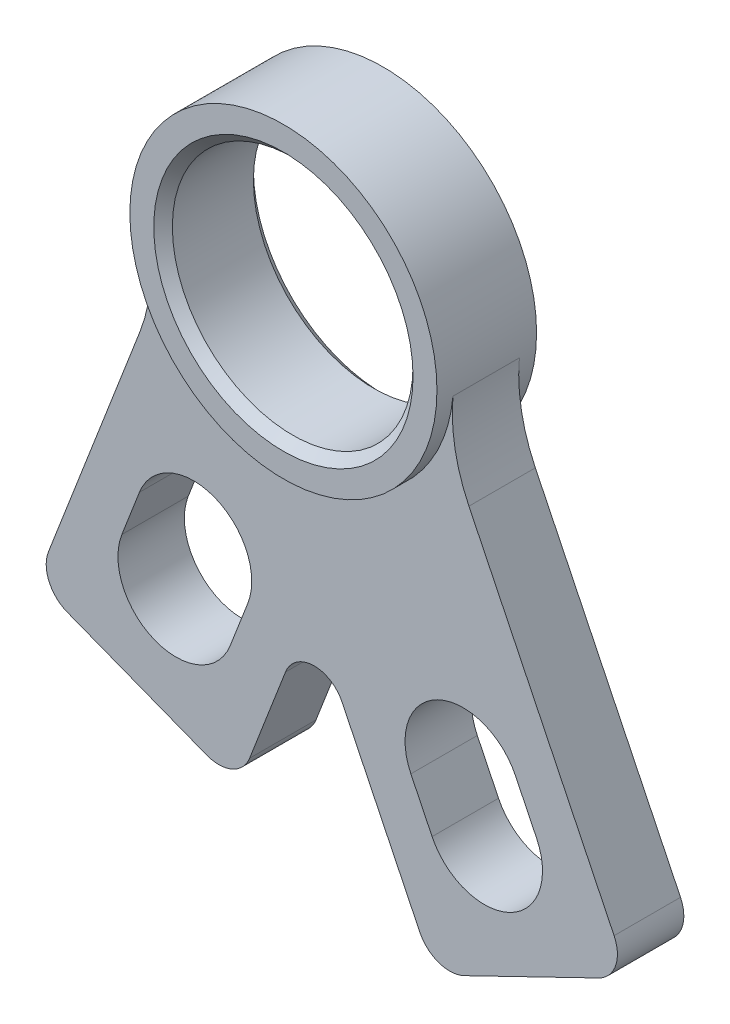
ISO-10303-21;
HEADER;
FILE_DESCRIPTION(('STEP AP214'),'2;1');
FILE_NAME('part.step','',(''),(''),'','','');
FILE_SCHEMA(('AUTOMOTIVE_DESIGN { 1 0 10303 214 1 1 1 1 }'));
ENDSEC;
DATA;
#1=APPLICATION_CONTEXT('core data for automotive mechanical design processes');
#2=APPLICATION_PROTOCOL_DEFINITION('international standard','automotive_design',2000,#1);
#3=PRODUCT_CONTEXT('',#1,'mechanical');
#4=PRODUCT('Part','Part','',(#3));
#5=PRODUCT_RELATED_PRODUCT_CATEGORY('part','',(#4));
#6=PRODUCT_DEFINITION_FORMATION('','',#4);
#7=PRODUCT_DEFINITION_CONTEXT('part definition',#1,'design');
#8=PRODUCT_DEFINITION('design','',#6,#7);
#9=PRODUCT_DEFINITION_SHAPE('','',#8);
#10=(LENGTH_UNIT() NAMED_UNIT(*) SI_UNIT(.MILLI.,.METRE.));
#11=(NAMED_UNIT(*) PLANE_ANGLE_UNIT() SI_UNIT($,.RADIAN.));
#12=(NAMED_UNIT(*) SI_UNIT($,.STERADIAN.) SOLID_ANGLE_UNIT());
#13=UNCERTAINTY_MEASURE_WITH_UNIT(LENGTH_MEASURE(1.E-05),#10,'distance_accuracy_value','');
#14=(GEOMETRIC_REPRESENTATION_CONTEXT(3) GLOBAL_UNCERTAINTY_ASSIGNED_CONTEXT((#13)) GLOBAL_UNIT_ASSIGNED_CONTEXT((#10,
#11,#12)) REPRESENTATION_CONTEXT('',''));
#15=CARTESIAN_POINT('',(0.,0.,0.));
#16=DIRECTION('',(0.,0.,1.));
#17=DIRECTION('',(1.,0.,0.));
#18=AXIS2_PLACEMENT_3D('',#15,#16,#17);
#19=CARTESIAN_POINT('',(0.,0.,4.7625));
#20=DIRECTION('',(0.,0.,-1.));
#21=DIRECTION('',(-1.,0.,0.));
#22=AXIS2_PLACEMENT_3D('',#19,#20,#21);
#23=CYLINDRICAL_SURFACE('',#22,11.5062);
#24=CARTESIAN_POINT('',(0.,0.,-3.87350000000002));
#25=DIRECTION('',(0.,0.,1.));
#26=DIRECTION('',(1.,0.,0.));
#27=AXIS2_PLACEMENT_3D('',#24,#25,#26);
#28=CIRCLE('',#27,11.5062);
#29=CARTESIAN_POINT('',(-11.5062,0.,-3.87350000000002));
#30=VERTEX_POINT('',#29);
#31=EDGE_CURVE('E50',#30,#30,#28,.F.);
#32=CARTESIAN_POINT('',(0.,0.,3.87349999999996));
#33=DIRECTION('',(0.,0.,1.));
#34=DIRECTION('',(1.,0.,0.));
#35=AXIS2_PLACEMENT_3D('',#32,#33,#34);
#36=CIRCLE('',#35,11.5062);
#37=CARTESIAN_POINT('',(-11.5062,0.,3.87349999999996));
#38=VERTEX_POINT('',#37);
#39=EDGE_CURVE('E480',#38,#38,#36,.T.);
#40=CARTESIAN_POINT('',(-11.5062,0.,-3.87350000000002));
#41=CARTESIAN_POINT('',(-11.5062,0.,-3.79280208333335));
#42=CARTESIAN_POINT('',(-11.5062,0.,-3.71210416666668));
#43=CARTESIAN_POINT('',(-11.5062,0.,-3.55070833333335));
#44=CARTESIAN_POINT('',(-11.5062,0.,-3.47001041666668));
#45=CARTESIAN_POINT('',(-11.5062,0.,-3.30861458333335));
#46=CARTESIAN_POINT('',(-11.5062,0.,-3.22791666666669));
#47=CARTESIAN_POINT('',(-11.5062,0.,-3.06652083333335));
#48=CARTESIAN_POINT('',(-11.5062,0.,-2.98582291666669));
#49=CARTESIAN_POINT('',(-11.5062,0.,-2.82442708333335));
#50=CARTESIAN_POINT('',(-11.5062,0.,-2.74372916666669));
#51=CARTESIAN_POINT('',(-11.5062,0.,-2.58233333333335));
#52=CARTESIAN_POINT('',(-11.5062,0.,-2.50163541666669));
#53=CARTESIAN_POINT('',(-11.5062,0.,-2.34023958333336));
#54=CARTESIAN_POINT('',(-11.5062,0.,-2.25954166666669));
#55=CARTESIAN_POINT('',(-11.5062,0.,-2.09814583333336));
#56=CARTESIAN_POINT('',(-11.5062,0.,-2.01744791666669));
#57=CARTESIAN_POINT('',(-11.5062,0.,-1.85605208333336));
#58=CARTESIAN_POINT('',(-11.5062,0.,-1.77535416666669));
#59=CARTESIAN_POINT('',(-11.5062,0.,-1.61395833333336));
#60=CARTESIAN_POINT('',(-11.5062,0.,-1.53326041666669));
#61=CARTESIAN_POINT('',(-11.5062,0.,-1.37186458333336));
#62=CARTESIAN_POINT('',(-11.5062,0.,-1.29116666666669));
#63=CARTESIAN_POINT('',(-11.5062,0.,-1.12977083333336));
#64=CARTESIAN_POINT('',(-11.5062,0.,-1.04907291666669));
#65=CARTESIAN_POINT('',(-11.5062,0.,-0.887677083333361));
#66=CARTESIAN_POINT('',(-11.5062,0.,-0.806979166666695));
#67=CARTESIAN_POINT('',(-11.5062,0.,-0.645583333333362));
#68=CARTESIAN_POINT('',(-11.5062,0.,-0.564885416666695));
#69=CARTESIAN_POINT('',(-11.5062,0.,-0.403489583333362));
#70=CARTESIAN_POINT('',(-11.5062,0.,-0.322791666666696));
#71=CARTESIAN_POINT('',(-11.5062,0.,-0.161395833333363));
#72=CARTESIAN_POINT('',(-11.5062,0.,-0.0806979166666968));
#73=CARTESIAN_POINT('',(-11.5062,0.,0.0806979166666361));
#74=CARTESIAN_POINT('',(-11.5062,0.,0.161395833333302));
#75=CARTESIAN_POINT('',(-11.5062,0.,0.322791666666635));
#76=CARTESIAN_POINT('',(-11.5062,0.,0.403489583333302));
#77=CARTESIAN_POINT('',(-11.5062,0.,0.564885416666635));
#78=CARTESIAN_POINT('',(-11.5062,0.,0.645583333333301));
#79=CARTESIAN_POINT('',(-11.5062,0.,0.806979166666634));
#80=CARTESIAN_POINT('',(-11.5062,0.,0.8876770833333));
#81=CARTESIAN_POINT('',(-11.5062,0.,1.04907291666663));
#82=CARTESIAN_POINT('',(-11.5062,0.,1.1297708333333));
#83=CARTESIAN_POINT('',(-11.5062,0.,1.29116666666663));
#84=CARTESIAN_POINT('',(-11.5062,0.,1.3718645833333));
#85=CARTESIAN_POINT('',(-11.5062,0.,1.53326041666663));
#86=CARTESIAN_POINT('',(-11.5062,0.,1.6139583333333));
#87=CARTESIAN_POINT('',(-11.5062,0.,1.77535416666663));
#88=CARTESIAN_POINT('',(-11.5062,0.,1.8560520833333));
#89=CARTESIAN_POINT('',(-11.5062,0.,2.01744791666663));
#90=CARTESIAN_POINT('',(-11.5062,0.,2.0981458333333));
#91=CARTESIAN_POINT('',(-11.5062,0.,2.25954166666663));
#92=CARTESIAN_POINT('',(-11.5062,0.,2.34023958333329));
#93=CARTESIAN_POINT('',(-11.5062,0.,2.50163541666663));
#94=CARTESIAN_POINT('',(-11.5062,0.,2.58233333333329));
#95=CARTESIAN_POINT('',(-11.5062,0.,2.74372916666663));
#96=CARTESIAN_POINT('',(-11.5062,0.,2.82442708333329));
#97=CARTESIAN_POINT('',(-11.5062,0.,2.98582291666663));
#98=CARTESIAN_POINT('',(-11.5062,0.,3.06652083333329));
#99=CARTESIAN_POINT('',(-11.5062,0.,3.22791666666662));
#100=CARTESIAN_POINT('',(-11.5062,0.,3.30861458333329));
#101=CARTESIAN_POINT('',(-11.5062,0.,3.47001041666662));
#102=CARTESIAN_POINT('',(-11.5062,0.,3.55070833333329));
#103=CARTESIAN_POINT('',(-11.5062,0.,3.71210416666662));
#104=CARTESIAN_POINT('',(-11.5062,0.,3.79280208333329));
#105=CARTESIAN_POINT('',(-11.5062,0.,3.87349999999996));
#106=B_SPLINE_CURVE_WITH_KNOTS('',3,(#40,#41,#42,#43,#44,#45,#46,#47,#48,#49,#50,#51,#52,#53,
#54,#55,#56,#57,#58,#59,#60,#61,#62,#63,#64,#65,#66,#67,#68,#69,#70,#71,#72,#73,#74,#75,#76,#77,
#78,#79,#80,#81,#82,#83,#84,#85,#86,#87,#88,#89,#90,#91,#92,#93,#94,#95,#96,#97,#98,#99,#100,
#101,#102,#103,#104,#105),.UNSPECIFIED.,.F.,.F.,(4,2,2,2,2,2,2,2,2,2,2,2,2,2,2,2,2,2,2,2,2,2,2,
2,2,2,2,2,2,2,2,2,4),(0.,0.242093749999998,0.484187499999998,0.726281249999997,
0.968374999999996,1.21046875,1.45256249999999,1.69465624999999,1.93674999999999,
2.17884374999999,2.42093749999999,2.66303124999999,2.90512499999999,3.14721874999999,
3.38931249999999,3.63140624999999,3.87349999999999,4.11559374999999,4.35768749999998,
4.59978124999998,4.84187499999998,5.08396874999998,5.32606249999998,5.56815624999998,
5.81024999999998,6.05234374999998,6.29443749999998,6.53653124999998,6.77862499999998,
7.02071874999997,7.26281249999997,7.50490624999997,7.74699999999997),.UNSPECIFIED.);
#107=EDGE_CURVE('BSEAM41',#30,#38,#106,.T.);
#108=ORIENTED_EDGE('',*,*,#31,.T.);
#109=ORIENTED_EDGE('',*,*,#39,.T.);
#110=ORIENTED_EDGE('',*,*,#107,.T.);
#111=ORIENTED_EDGE('',*,*,#107,.F.);
#112=EDGE_LOOP('',(#108,#110,#109,#111));
#113=FACE_BOUND('',#112,.T.);
#114=ADVANCED_FACE('F41',(#113),#23,.F.);
#115=CARTESIAN_POINT('',(0.,0.,4.7625));
#116=DIRECTION('',(0.,0.,-1.));
#117=DIRECTION('',(-1.,0.,0.));
#118=AXIS2_PLACEMENT_3D('',#115,#116,#117);
#119=CYLINDRICAL_SURFACE('',#118,14.6812);
#120=DIRECTION('',(0.,0.,-1.));
#121=VECTOR('',#120,1.);
#122=CARTESIAN_POINT('',(-14.4661395463881,-2.50368529660316,3.175));
#123=LINE('',#122,#121);
#124=CARTESIAN_POINT('',(-14.4661395463881,-2.50368529660317,3.175));
#125=VERTEX_POINT('',#124);
#126=CARTESIAN_POINT('',(-14.4661395463881,-2.50368529660317,-3.175));
#127=VERTEX_POINT('',#126);
#128=EDGE_CURVE('E428',#125,#127,#123,.T.);
#129=ORIENTED_EDGE('',*,*,#128,.F.);
#130=CARTESIAN_POINT('',(0.,0.,3.175));
#131=DIRECTION('',(0.,0.,1.));
#132=DIRECTION('',(1.,0.,0.));
#133=AXIS2_PLACEMENT_3D('',#130,#131,#132);
#134=CIRCLE('',#133,14.6812);
#135=CARTESIAN_POINT('',(14.6225689560155,-1.31076716718586,3.175));
#136=VERTEX_POINT('',#135);
#137=EDGE_CURVE('E287',#125,#136,#134,.T.);
#138=ORIENTED_EDGE('',*,*,#137,.T.);
#139=DIRECTION('',(0.,0.,-1.));
#140=VECTOR('',#139,1.);
#141=CARTESIAN_POINT('',(14.6225689560155,-1.31076716718586,3.175));
#142=LINE('',#141,#140);
#143=CARTESIAN_POINT('',(14.6225689560155,-1.31076716718586,-3.175));
#144=VERTEX_POINT('',#143);
#145=EDGE_CURVE('E431',#136,#144,#142,.T.);
#146=ORIENTED_EDGE('',*,*,#145,.T.);
#147=CARTESIAN_POINT('',(0.,0.,-3.175));
#148=DIRECTION('',(0.,0.,1.));
#149=DIRECTION('',(1.,0.,0.));
#150=AXIS2_PLACEMENT_3D('',#147,#148,#149);
#151=CIRCLE('',#150,14.6812);
#152=EDGE_CURVE('E357',#127,#144,#151,.T.);
#153=ORIENTED_EDGE('',*,*,#152,.F.);
#154=EDGE_LOOP('',(#129,#138,#146,#153));
#155=FACE_BOUND('',#154,.T.);
#156=CARTESIAN_POINT('',(0.,0.,4.7625));
#157=DIRECTION('',(0.,0.,1.));
#158=DIRECTION('',(1.,0.,0.));
#159=AXIS2_PLACEMENT_3D('',#156,#157,#158);
#160=CIRCLE('',#159,14.6812);
#161=CARTESIAN_POINT('',(14.6812,0.,4.7625));
#162=VERTEX_POINT('',#161);
#163=EDGE_CURVE('E449',#162,#162,#160,.T.);
#164=ORIENTED_EDGE('',*,*,#163,.F.);
#165=EDGE_LOOP('',(#164));
#166=FACE_BOUND('',#165,.T.);
#167=CARTESIAN_POINT('',(0.,0.,-4.7625));
#168=DIRECTION('',(0.,0.,1.));
#169=DIRECTION('',(1.,0.,0.));
#170=AXIS2_PLACEMENT_3D('',#167,#168,#169);
#171=CIRCLE('',#170,14.6812);
#172=CARTESIAN_POINT('',(14.6812,0.,-4.7625));
#173=VERTEX_POINT('',#172);
#174=EDGE_CURVE('E412',#173,#173,#171,.T.);
#175=ORIENTED_EDGE('',*,*,#174,.T.);
#176=EDGE_LOOP('',(#175));
#177=FACE_BOUND('',#176,.T.);
#178=ADVANCED_FACE('F503',(#155,#166,#177),#119,.T.);
#179=CARTESIAN_POINT('',(0.,0.,4.7625));
#180=DIRECTION('',(0.,0.,1.));
#181=DIRECTION('',(1.,0.,0.));
#182=AXIS2_PLACEMENT_3D('',#179,#180,#181);
#183=PLANE('',#182);
#184=CARTESIAN_POINT('',(0.,0.,4.7625));
#185=DIRECTION('',(0.,0.,1.));
#186=DIRECTION('',(1.,0.,0.));
#187=AXIS2_PLACEMENT_3D('',#184,#185,#186);
#188=CIRCLE('',#187,12.3952);
#189=CARTESIAN_POINT('',(12.3952,0.,4.7625));
#190=VERTEX_POINT('',#189);
#191=EDGE_CURVE('E11',#190,#190,#188,.F.);
#192=ORIENTED_EDGE('',*,*,#191,.T.);
#193=EDGE_LOOP('',(#192));
#194=FACE_BOUND('',#193,.T.);
#195=ORIENTED_EDGE('',*,*,#163,.T.);
#196=EDGE_LOOP('',(#195));
#197=FACE_BOUND('',#196,.T.);
#198=ADVANCED_FACE('F499',(#194,#197),#183,.T.);
#199=CARTESIAN_POINT('',(0.,0.,-4.7625));
#200=DIRECTION('',(0.,0.,1.));
#201=DIRECTION('',(1.,0.,0.));
#202=AXIS2_PLACEMENT_3D('',#199,#200,#201);
#203=PLANE('',#202);
#204=CARTESIAN_POINT('',(0.,0.,-4.7625));
#205=DIRECTION('',(0.,0.,1.));
#206=DIRECTION('',(1.,0.,0.));
#207=AXIS2_PLACEMENT_3D('',#204,#205,#206);
#208=CIRCLE('',#207,12.3952);
#209=CARTESIAN_POINT('',(12.3952,0.,-4.7625));
#210=VERTEX_POINT('',#209);
#211=EDGE_CURVE('E476',#210,#210,#208,.T.);
#212=ORIENTED_EDGE('',*,*,#211,.T.);
#213=EDGE_LOOP('',(#212));
#214=FACE_BOUND('',#213,.T.);
#215=ORIENTED_EDGE('',*,*,#174,.F.);
#216=EDGE_LOOP('',(#215));
#217=FACE_BOUND('',#216,.T.);
#218=ADVANCED_FACE('F495',(#214,#217),#203,.F.);
#219=CARTESIAN_POINT('',(15.5995031163131,-32.1680392605869,3.175));
#220=DIRECTION('',(0.,0.,-1.));
#221=DIRECTION('',(-1.,0.,0.));
#222=AXIS2_PLACEMENT_3D('',#219,#220,#221);
#223=CYLINDRICAL_SURFACE('',#222,5.5562499999984);
#224=CARTESIAN_POINT('',(15.5995031163131,-32.1680392605869,-3.175));
#225=DIRECTION('',(0.,0.,1.));
#226=DIRECTION('',(1.,0.,0.));
#227=AXIS2_PLACEMENT_3D('',#224,#225,#226);
#228=CIRCLE('',#227,5.5562499999984);
#229=CARTESIAN_POINT('',(20.5989196461262,-29.7436324416074,-3.175));
#230=VERTEX_POINT('',#229);
#231=CARTESIAN_POINT('',(10.6000865865001,-34.5924460795664,-3.175));
#232=VERTEX_POINT('',#231);
#233=EDGE_CURVE('E388',#230,#232,#228,.T.);
#234=ORIENTED_EDGE('',*,*,#233,.F.);
#235=DIRECTION('',(0.,0.,-1.));
#236=VECTOR('',#235,1.);
#237=CARTESIAN_POINT('',(20.5989196461262,-29.7436324416074,3.175));
#238=LINE('',#237,#236);
#239=CARTESIAN_POINT('',(20.5989196461262,-29.7436324416074,3.175));
#240=VERTEX_POINT('',#239);
#241=EDGE_CURVE('E409',#240,#230,#238,.T.);
#242=ORIENTED_EDGE('',*,*,#241,.F.);
#243=CARTESIAN_POINT('',(15.5995031163131,-32.1680392605869,3.175));
#244=DIRECTION('',(0.,0.,1.));
#245=DIRECTION('',(1.,0.,0.));
#246=AXIS2_PLACEMENT_3D('',#243,#244,#245);
#247=CIRCLE('',#246,5.5562499999984);
#248=CARTESIAN_POINT('',(10.6000865865001,-34.5924460795664,3.175));
#249=VERTEX_POINT('',#248);
#250=EDGE_CURVE('E314',#240,#249,#247,.T.);
#251=ORIENTED_EDGE('',*,*,#250,.T.);
#252=DIRECTION('',(0.,0.,-1.));
#253=VECTOR('',#252,1.);
#254=CARTESIAN_POINT('',(10.6000865865001,-34.5924460795664,3.175));
#255=LINE('',#254,#253);
#256=EDGE_CURVE('E399',#249,#232,#255,.T.);
#257=ORIENTED_EDGE('',*,*,#256,.T.);
#258=EDGE_LOOP('',(#234,#242,#251,#257));
#259=FACE_BOUND('',#258,.T.);
#260=ADVANCED_FACE('F498',(#259),#223,.F.);
#261=CARTESIAN_POINT('',(4.99941652981302,2.42440681897946,3.175));
#262=DIRECTION('',(-0.89978250255379,-0.436338685080796,0.));
#263=DIRECTION('',(0.436338685080796,-0.89978250255379,0.));
#264=AXIS2_PLACEMENT_3D('',#261,#262,#263);
#265=PLANE('',#264);
#266=DIRECTION('',(-0.436338685080796,0.89978250255379,0.));
#267=VECTOR('',#266,1.);
#268=CARTESIAN_POINT('',(4.99941652981302,2.42440681897946,-3.175));
#269=LINE('',#268,#267);
#270=CARTESIAN_POINT('',(22.6267282232279,-33.925216010955,-3.175));
#271=VERTEX_POINT('',#270);
#272=EDGE_CURVE('E392',#271,#230,#269,.T.);
#273=ORIENTED_EDGE('',*,*,#272,.F.);
#274=DIRECTION('',(0.,0.,-1.));
#275=VECTOR('',#274,1.);
#276=CARTESIAN_POINT('',(22.6267282232279,-33.925216010955,3.175));
#277=LINE('',#276,#275);
#278=CARTESIAN_POINT('',(22.6267282232279,-33.925216010955,3.175));
#279=VERTEX_POINT('',#278);
#280=EDGE_CURVE('E406',#279,#271,#277,.T.);
#281=ORIENTED_EDGE('',*,*,#280,.F.);
#282=DIRECTION('',(-0.436338685080796,0.89978250255379,0.));
#283=VECTOR('',#282,1.);
#284=CARTESIAN_POINT('',(4.99941652981302,2.42440681897946,3.175));
#285=LINE('',#284,#283);
#286=EDGE_CURVE('E318',#279,#240,#285,.T.);
#287=ORIENTED_EDGE('',*,*,#286,.T.);
#288=ORIENTED_EDGE('',*,*,#241,.T.);
#289=EDGE_LOOP('',(#273,#281,#287,#288));
#290=FACE_BOUND('',#289,.T.);
#291=ADVANCED_FACE('F712',(#290),#265,.T.);
#292=CARTESIAN_POINT('',(17.6273116934148,-36.3496228299345,3.175));
#293=DIRECTION('',(0.,0.,-1.));
#294=DIRECTION('',(-1.,0.,0.));
#295=AXIS2_PLACEMENT_3D('',#292,#293,#294);
#296=CYLINDRICAL_SURFACE('',#295,5.5562499999984);
#297=CARTESIAN_POINT('',(17.6273116934148,-36.3496228299345,-3.175));
#298=DIRECTION('',(0.,0.,1.));
#299=DIRECTION('',(1.,0.,0.));
#300=AXIS2_PLACEMENT_3D('',#297,#298,#299);
#301=CIRCLE('',#300,5.5562499999984);
#302=CARTESIAN_POINT('',(12.6278951636018,-38.774029648914,-3.175));
#303=VERTEX_POINT('',#302);
#304=EDGE_CURVE('E265',#303,#271,#301,.T.);
#305=ORIENTED_EDGE('',*,*,#304,.F.);
#306=DIRECTION('',(0.,0.,-1.));
#307=VECTOR('',#306,1.);
#308=CARTESIAN_POINT('',(12.6278951636018,-38.774029648914,3.175));
#309=LINE('',#308,#307);
#310=CARTESIAN_POINT('',(12.6278951636018,-38.774029648914,3.175));
#311=VERTEX_POINT('',#310);
#312=EDGE_CURVE('E402',#311,#303,#309,.T.);
#313=ORIENTED_EDGE('',*,*,#312,.F.);
#314=CARTESIAN_POINT('',(17.6273116934148,-36.3496228299345,3.175));
#315=DIRECTION('',(0.,0.,1.));
#316=DIRECTION('',(1.,0.,0.));
#317=AXIS2_PLACEMENT_3D('',#314,#315,#316);
#318=CIRCLE('',#317,5.5562499999984);
#319=EDGE_CURVE('E322',#311,#279,#318,.T.);
#320=ORIENTED_EDGE('',*,*,#319,.T.);
#321=ORIENTED_EDGE('',*,*,#280,.T.);
#322=EDGE_LOOP('',(#305,#313,#320,#321));
#323=FACE_BOUND('',#322,.T.);
#324=ADVANCED_FACE('F603',(#323),#296,.F.);
#325=CARTESIAN_POINT('',(-10.1727122090915,-26.2624614180122,3.175));
#326=DIRECTION('',(0.,0.,-1.));
#327=DIRECTION('',(-1.,0.,0.));
#328=AXIS2_PLACEMENT_3D('',#325,#326,#327);
#329=CYLINDRICAL_SURFACE('',#328,5.55624999999839);
#330=CARTESIAN_POINT('',(-10.1727122090915,-26.2624614180122,-3.175));
#331=DIRECTION('',(0.,0.,1.));
#332=DIRECTION('',(1.,0.,0.));
#333=AXIS2_PLACEMENT_3D('',#330,#331,#332);
#334=CIRCLE('',#333,5.55624999999839);
#335=CARTESIAN_POINT('',(-4.99156905500975,-28.2693669163837,-3.175));
#336=VERTEX_POINT('',#335);
#337=CARTESIAN_POINT('',(-15.3538553631733,-24.2555559196406,-3.175));
#338=VERTEX_POINT('',#337);
#339=EDGE_CURVE('E372',#336,#338,#334,.T.);
#340=ORIENTED_EDGE('',*,*,#339,.F.);
#341=DIRECTION('',(0.,0.,-1.));
#342=VECTOR('',#341,1.);
#343=CARTESIAN_POINT('',(-4.99156905500975,-28.2693669163837,3.175));
#344=LINE('',#343,#342);
#345=CARTESIAN_POINT('',(-4.99156905500975,-28.2693669163837,3.175));
#346=VERTEX_POINT('',#345);
#347=EDGE_CURVE('E403',#346,#336,#344,.T.);
#348=ORIENTED_EDGE('',*,*,#347,.F.);
#349=CARTESIAN_POINT('',(-10.1727122090915,-26.2624614180122,3.175));
#350=DIRECTION('',(0.,0.,1.));
#351=DIRECTION('',(1.,0.,0.));
#352=AXIS2_PLACEMENT_3D('',#349,#350,#351);
#353=CIRCLE('',#352,5.55624999999839);
#354=CARTESIAN_POINT('',(-15.3538553631733,-24.2555559196406,3.175));
#355=VERTEX_POINT('',#354);
#356=EDGE_CURVE('E299',#346,#355,#353,.T.);
#357=ORIENTED_EDGE('',*,*,#356,.T.);
#358=DIRECTION('',(0.,0.,-1.));
#359=VECTOR('',#358,1.);
#360=CARTESIAN_POINT('',(-15.3538553631733,-24.2555559196406,3.175));
#361=LINE('',#360,#359);
#362=EDGE_CURVE('E242',#355,#338,#361,.T.);
#363=ORIENTED_EDGE('',*,*,#362,.T.);
#364=EDGE_LOOP('',(#340,#348,#357,#363));
#365=FACE_BOUND('',#364,.T.);
#366=ADVANCED_FACE('F593',(#365),#329,.F.);
#367=CARTESIAN_POINT('',(5.18114315408177,-2.00690549837153,3.175));
#368=DIRECTION('',(-0.932489206584164,0.361197839976981,0.));
#369=DIRECTION('',(-0.361197839976981,-0.932489206584164,0.));
#370=AXIS2_PLACEMENT_3D('',#367,#368,#369);
#371=PLANE('',#370);
#372=DIRECTION('',(0.361197839976981,0.932489206584164,0.));
#373=VECTOR('',#372,1.);
#374=CARTESIAN_POINT('',(5.18114315408177,-2.00690549837153,-3.175));
#375=LINE('',#374,#373);
#376=CARTESIAN_POINT('',(-6.67017354959018,-32.6029492363103,-3.175));
#377=VERTEX_POINT('',#376);
#378=EDGE_CURVE('E376',#377,#336,#375,.T.);
#379=ORIENTED_EDGE('',*,*,#378,.F.);
#380=DIRECTION('',(0.,0.,-1.));
#381=VECTOR('',#380,1.);
#382=CARTESIAN_POINT('',(-6.67017354959018,-32.6029492363103,3.175));
#383=LINE('',#382,#381);
#384=CARTESIAN_POINT('',(-6.67017354959018,-32.6029492363103,3.175));
#385=VERTEX_POINT('',#384);
#386=EDGE_CURVE('E418',#385,#377,#383,.T.);
#387=ORIENTED_EDGE('',*,*,#386,.F.);
#388=DIRECTION('',(0.361197839976981,0.932489206584164,0.));
#389=VECTOR('',#388,1.);
#390=CARTESIAN_POINT('',(5.18114315408177,-2.00690549837153,3.175));
#391=LINE('',#390,#389);
#392=EDGE_CURVE('E303',#385,#346,#391,.T.);
#393=ORIENTED_EDGE('',*,*,#392,.T.);
#394=ORIENTED_EDGE('',*,*,#347,.T.);
#395=EDGE_LOOP('',(#379,#387,#393,#394));
#396=FACE_BOUND('',#395,.T.);
#397=ADVANCED_FACE('F587',(#396),#371,.T.);
#398=CARTESIAN_POINT('',(-11.8513167036719,-30.5960437379387,3.175));
#399=DIRECTION('',(0.,0.,-1.));
#400=DIRECTION('',(-1.,0.,0.));
#401=AXIS2_PLACEMENT_3D('',#398,#399,#400);
#402=CYLINDRICAL_SURFACE('',#401,5.55624999999839);
#403=CARTESIAN_POINT('',(-11.8513167036719,-30.5960437379387,-3.175));
#404=DIRECTION('',(0.,0.,1.));
#405=DIRECTION('',(1.,0.,0.));
#406=AXIS2_PLACEMENT_3D('',#403,#404,#405);
#407=CIRCLE('',#406,5.55624999999839);
#408=CARTESIAN_POINT('',(-17.0324598577537,-28.5891382395672,-3.175));
#409=VERTEX_POINT('',#408);
#410=EDGE_CURVE('E380',#409,#377,#407,.T.);
#411=ORIENTED_EDGE('',*,*,#410,.F.);
#412=DIRECTION('',(0.,0.,-1.));
#413=VECTOR('',#412,1.);
#414=CARTESIAN_POINT('',(-17.0324598577537,-28.5891382395672,3.175));
#415=LINE('',#414,#413);
#416=CARTESIAN_POINT('',(-17.0324598577537,-28.5891382395672,3.175));
#417=VERTEX_POINT('',#416);
#418=EDGE_CURVE('E415',#417,#409,#415,.T.);
#419=ORIENTED_EDGE('',*,*,#418,.F.);
#420=CARTESIAN_POINT('',(-11.8513167036719,-30.5960437379387,3.175));
#421=DIRECTION('',(0.,0.,1.));
#422=DIRECTION('',(1.,0.,0.));
#423=AXIS2_PLACEMENT_3D('',#420,#421,#422);
#424=CIRCLE('',#423,5.55624999999839);
#425=EDGE_CURVE('E307',#417,#385,#424,.T.);
#426=ORIENTED_EDGE('',*,*,#425,.T.);
#427=ORIENTED_EDGE('',*,*,#386,.T.);
#428=EDGE_LOOP('',(#411,#419,#426,#427));
#429=FACE_BOUND('',#428,.T.);
#430=ADVANCED_FACE('F583',(#429),#402,.F.);
#431=CARTESIAN_POINT('',(-7.77007688476361,-39.8379952118207,3.175));
#432=DIRECTION('',(0.,0.,-1.));
#433=DIRECTION('',(-1.,0.,0.));
#434=AXIS2_PLACEMENT_3D('',#431,#432,#433);
#435=CYLINDRICAL_SURFACE('',#434,3.175);
#436=CARTESIAN_POINT('',(-7.77007688476361,-39.8379952118207,-3.175));
#437=DIRECTION('',(0.,0.,1.));
#438=DIRECTION('',(1.,0.,0.));
#439=AXIS2_PLACEMENT_3D('',#436,#437,#438);
#440=CIRCLE('',#439,3.175);
#441=CARTESIAN_POINT('',(-4.82012448348686,-41.0120505044715,-3.175));
#442=VERTEX_POINT('',#441);
#443=CARTESIAN_POINT('',(-8.8895303596633,-42.8090975186312,-3.175));
#444=VERTEX_POINT('',#443);
#445=EDGE_CURVE('E238',#442,#444,#440,.F.);
#446=ORIENTED_EDGE('',*,*,#445,.F.);
#447=DIRECTION('',(0.,0.,-1.));
#448=VECTOR('',#447,1.);
#449=CARTESIAN_POINT('',(-4.82012448348686,-41.0120505044715,3.175));
#450=LINE('',#449,#448);
#451=CARTESIAN_POINT('',(-4.82012448348686,-41.0120505044715,3.175));
#452=VERTEX_POINT('',#451);
#453=EDGE_CURVE('E231',#452,#442,#450,.T.);
#454=ORIENTED_EDGE('',*,*,#453,.F.);
#455=CARTESIAN_POINT('',(-7.77007688476361,-39.8379952118207,3.175));
#456=DIRECTION('',(0.,0.,1.));
#457=DIRECTION('',(1.,0.,0.));
#458=AXIS2_PLACEMENT_3D('',#455,#456,#457);
#459=CIRCLE('',#458,3.175);
#460=CARTESIAN_POINT('',(-8.8895303596633,-42.8090975186312,3.175));
#461=VERTEX_POINT('',#460);
#462=EDGE_CURVE('E236',#452,#461,#459,.F.);
#463=ORIENTED_EDGE('',*,*,#462,.T.);
#464=DIRECTION('',(0.,0.,-1.));
#465=VECTOR('',#464,1.);
#466=CARTESIAN_POINT('',(-8.8895303596633,-42.8090975186312,3.175));
#467=LINE('',#466,#465);
#468=EDGE_CURVE('E329',#461,#444,#467,.T.);
#469=ORIENTED_EDGE('',*,*,#468,.T.);
#470=EDGE_LOOP('',(#446,#454,#463,#469));
#471=FACE_BOUND('',#470,.T.);
#472=ADVANCED_FACE('F233',(#471),#435,.T.);
#473=CARTESIAN_POINT('',(9.62212300043885,-3.72711021126189,3.175));
#474=DIRECTION('',(-0.932489206584164,0.361197839976981,0.));
#475=DIRECTION('',(-0.361197839976981,-0.932489206584164,0.));
#476=AXIS2_PLACEMENT_3D('',#473,#474,#475);
#477=PLANE('',#476);
#478=DIRECTION('',(0.361197839976981,0.932489206584164,0.));
#479=VECTOR('',#478,1.);
#480=CARTESIAN_POINT('',(9.62212300043885,-3.72711021126189,-3.175));
#481=LINE('',#480,#479);
#482=CARTESIAN_POINT('',(-1.38989145594289,-32.1563627892373,-3.175));
#483=VERTEX_POINT('',#482);
#484=EDGE_CURVE('E332',#442,#483,#481,.T.);
#485=ORIENTED_EDGE('',*,*,#484,.T.);
#486=DIRECTION('',(0.,0.,-1.));
#487=VECTOR('',#486,1.);
#488=CARTESIAN_POINT('',(-1.38989145594289,-32.1563627892373,3.175));
#489=LINE('',#488,#487);
#490=CARTESIAN_POINT('',(-1.38989145594289,-32.1563627892373,3.175));
#491=VERTEX_POINT('',#490);
#492=EDGE_CURVE('E243',#491,#483,#489,.T.);
#493=ORIENTED_EDGE('',*,*,#492,.F.);
#494=DIRECTION('',(0.361197839976981,0.932489206584164,0.));
#495=VECTOR('',#494,1.);
#496=CARTESIAN_POINT('',(9.62212300043885,-3.72711021126189,3.175));
#497=LINE('',#496,#495);
#498=EDGE_CURVE('E246',#452,#491,#497,.T.);
#499=ORIENTED_EDGE('',*,*,#498,.F.);
#500=ORIENTED_EDGE('',*,*,#453,.T.);
#501=EDGE_LOOP('',(#485,#493,#499,#500));
#502=FACE_BOUND('',#501,.T.);
#503=ADVANCED_FACE('F247',(#502),#477,.F.);
#504=CARTESIAN_POINT('',(1.36244245301173,-33.2224738560361,3.175));
#505=DIRECTION('',(0.,0.,-1.));
#506=DIRECTION('',(-1.,0.,0.));
#507=AXIS2_PLACEMENT_3D('',#504,#505,#506);
#508=CYLINDRICAL_SURFACE('',#507,2.95159867751908);
#509=CARTESIAN_POINT('',(1.36244245301173,-33.2224738560361,-3.175));
#510=DIRECTION('',(0.,0.,1.));
#511=DIRECTION('',(1.,0.,0.));
#512=AXIS2_PLACEMENT_3D('',#509,#510,#511);
#513=CIRCLE('',#512,2.95159867751908);
#514=CARTESIAN_POINT('',(4.01823929760431,-31.9345771702012,-3.175));
#515=VERTEX_POINT('',#514);
#516=EDGE_CURVE('E335',#483,#515,#513,.F.);
#517=ORIENTED_EDGE('',*,*,#516,.T.);
#518=DIRECTION('',(0.,0.,-1.));
#519=VECTOR('',#518,1.);
#520=CARTESIAN_POINT('',(4.01823929760431,-31.9345771702012,3.175));
#521=LINE('',#520,#519);
#522=CARTESIAN_POINT('',(4.01823929760431,-31.9345771702012,3.175));
#523=VERTEX_POINT('',#522);
#524=EDGE_CURVE('E444',#523,#515,#521,.T.);
#525=ORIENTED_EDGE('',*,*,#524,.F.);
#526=CARTESIAN_POINT('',(1.36244245301173,-33.2224738560361,3.175));
#527=DIRECTION('',(0.,0.,1.));
#528=DIRECTION('',(1.,0.,0.));
#529=AXIS2_PLACEMENT_3D('',#526,#527,#528);
#530=CIRCLE('',#529,2.95159867751908);
#531=EDGE_CURVE('E251',#491,#523,#530,.F.);
#532=ORIENTED_EDGE('',*,*,#531,.F.);
#533=ORIENTED_EDGE('',*,*,#492,.T.);
#534=EDGE_LOOP('',(#517,#525,#532,#533));
#535=FACE_BOUND('',#534,.T.);
#536=ADVANCED_FACE('F555',(#535),#508,.F.);
#537=CARTESIAN_POINT('',(-9.28463069822552,-4.50246980667678,3.175));
#538=DIRECTION('',(-0.89978250255379,-0.436338685080796,0.));
#539=DIRECTION('',(0.436338685080796,-0.899782502553791,0.));
#540=AXIS2_PLACEMENT_3D('',#537,#538,#539);
#541=PLANE('',#540);
#542=DIRECTION('',(-0.436338685080796,0.89978250255379,0.));
#543=VECTOR('',#542,1.);
#544=CARTESIAN_POINT('',(-9.28463069822552,-4.50246980667678,-3.175));
#545=LINE('',#544,#543);
#546=CARTESIAN_POINT('',(11.4597754767346,-47.2799138892285,-3.175));
#547=VERTEX_POINT('',#546);
#548=EDGE_CURVE('E339',#547,#515,#545,.T.);
#549=ORIENTED_EDGE('',*,*,#548,.F.);
#550=DIRECTION('',(0.,0.,-1.));
#551=VECTOR('',#550,1.);
#552=CARTESIAN_POINT('',(11.4597754767346,-47.2799138892285,3.175));
#553=LINE('',#552,#551);
#554=CARTESIAN_POINT('',(11.4597754767346,-47.2799138892285,3.175));
#555=VERTEX_POINT('',#554);
#556=EDGE_CURVE('E441',#555,#547,#553,.T.);
#557=ORIENTED_EDGE('',*,*,#556,.F.);
#558=DIRECTION('',(-0.436338685080796,0.89978250255379,0.));
#559=VECTOR('',#558,1.);
#560=CARTESIAN_POINT('',(-9.28463069822552,-4.50246980667678,3.175));
#561=LINE('',#560,#559);
#562=EDGE_CURVE('E270',#555,#523,#561,.T.);
#563=ORIENTED_EDGE('',*,*,#562,.T.);
#564=ORIENTED_EDGE('',*,*,#524,.T.);
#565=EDGE_LOOP('',(#549,#557,#563,#564));
#566=FACE_BOUND('',#565,.T.);
#567=ADVANCED_FACE('F572',(#566),#541,.T.);
#568=CARTESIAN_POINT('',(14.3165849223429,-45.894538564097,3.175));
#569=DIRECTION('',(0.,0.,-1.));
#570=DIRECTION('',(-1.,0.,0.));
#571=AXIS2_PLACEMENT_3D('',#568,#569,#570);
#572=CYLINDRICAL_SURFACE('',#571,3.175);
#573=CARTESIAN_POINT('',(14.3165849223429,-45.894538564097,-3.175));
#574=DIRECTION('',(0.,0.,1.));
#575=DIRECTION('',(1.,0.,0.));
#576=AXIS2_PLACEMENT_3D('',#573,#574,#575);
#577=CIRCLE('',#576,3.175);
#578=CARTESIAN_POINT('',(15.7019602474744,-48.7513480097053,-3.175));
#579=VERTEX_POINT('',#578);
#580=EDGE_CURVE('E343',#579,#547,#577,.F.);
#581=ORIENTED_EDGE('',*,*,#580,.F.);
#582=DIRECTION('',(0.,0.,-1.));
#583=VECTOR('',#582,1.);
#584=CARTESIAN_POINT('',(15.7019602474744,-48.7513480097053,3.175));
#585=LINE('',#584,#583);
#586=CARTESIAN_POINT('',(15.7019602474744,-48.7513480097053,3.175));
#587=VERTEX_POINT('',#586);
#588=EDGE_CURVE('E438',#587,#579,#585,.T.);
#589=ORIENTED_EDGE('',*,*,#588,.F.);
#590=CARTESIAN_POINT('',(14.3165849223429,-45.894538564097,3.175));
#591=DIRECTION('',(0.,0.,1.));
#592=DIRECTION('',(1.,0.,0.));
#593=AXIS2_PLACEMENT_3D('',#590,#591,#592);
#594=CIRCLE('',#593,3.175);
#595=EDGE_CURVE('E274',#587,#555,#594,.F.);
#596=ORIENTED_EDGE('',*,*,#595,.T.);
#597=ORIENTED_EDGE('',*,*,#556,.T.);
#598=EDGE_LOOP('',(#581,#589,#596,#597));
#599=FACE_BOUND('',#598,.T.);
#600=ADVANCED_FACE('F562',(#599),#572,.T.);
#601=CARTESIAN_POINT('',(22.1297815000916,-45.63425352816,3.175));
#602=DIRECTION('',(-0.436338685080796,0.89978250255379,0.));
#603=DIRECTION('',(-0.89978250255379,-0.436338685080796,0.));
#604=AXIS2_PLACEMENT_3D('',#601,#602,#603);
#605=PLANE('',#604);
#606=DIRECTION('',(0.89978250255379,0.436338685080797,0.));
#607=VECTOR('',#606,1.);
#608=CARTESIAN_POINT('',(22.1297815000916,-45.63425352816,-3.175));
#609=LINE('',#608,#607);
#610=CARTESIAN_POINT('',(28.5576027527088,-42.5171590466148,-3.175));
#611=VERTEX_POINT('',#610);
#612=EDGE_CURVE('E347',#579,#611,#609,.T.);
#613=ORIENTED_EDGE('',*,*,#612,.T.);
#614=DIRECTION('',(0.,0.,-1.));
#615=VECTOR('',#614,1.);
#616=CARTESIAN_POINT('',(28.5576027527088,-42.5171590466148,3.175));
#617=LINE('',#616,#615);
#618=CARTESIAN_POINT('',(28.5576027527088,-42.5171590466148,3.175));
#619=VERTEX_POINT('',#618);
#620=EDGE_CURVE('E71',#611,#619,#617,.F.);
#621=ORIENTED_EDGE('',*,*,#620,.T.);
#622=DIRECTION('',(0.89978250255379,0.436338685080797,0.));
#623=VECTOR('',#622,1.);
#624=CARTESIAN_POINT('',(22.1297815000916,-45.63425352816,3.175));
#625=LINE('',#624,#623);
#626=EDGE_CURVE('E278',#587,#619,#625,.T.);
#627=ORIENTED_EDGE('',*,*,#626,.F.);
#628=ORIENTED_EDGE('',*,*,#588,.T.);
#629=EDGE_LOOP('',(#613,#621,#627,#628));
#630=FACE_BOUND('',#629,.T.);
#631=ADVANCED_FACE('F564',(#630),#605,.F.);
#632=CARTESIAN_POINT('',(9.28463069822543,4.50246980667674,3.175));
#633=DIRECTION('',(-0.89978250255379,-0.436338685080796,0.));
#634=DIRECTION('',(0.436338685080796,-0.89978250255379,0.));
#635=AXIS2_PLACEMENT_3D('',#632,#633,#634);
#636=PLANE('',#635);
#637=DIRECTION('',(-0.436338685080796,0.89978250255379,0.));
#638=VECTOR('',#637,1.);
#639=CARTESIAN_POINT('',(9.28463069822543,4.50246980667674,3.175));
#640=LINE('',#639,#638);
#641=CARTESIAN_POINT('',(30.0290368731855,-38.274974275875,3.175));
#642=VERTEX_POINT('',#641);
#643=CARTESIAN_POINT('',(16.1501231077484,-9.65499583348482,3.175));
#644=VERTEX_POINT('',#643);
#645=EDGE_CURVE('E280',#642,#644,#640,.T.);
#646=ORIENTED_EDGE('',*,*,#645,.F.);
#647=DIRECTION('',(0.,0.,-1.));
#648=VECTOR('',#647,1.);
#649=CARTESIAN_POINT('',(30.0290368731855,-38.274974275875,3.175));
#650=LINE('',#649,#648);
#651=CARTESIAN_POINT('',(30.0290368731855,-38.274974275875,-3.175));
#652=VERTEX_POINT('',#651);
#653=EDGE_CURVE('E470',#642,#652,#650,.T.);
#654=ORIENTED_EDGE('',*,*,#653,.T.);
#655=DIRECTION('',(-0.436338685080796,0.89978250255379,0.));
#656=VECTOR('',#655,1.);
#657=CARTESIAN_POINT('',(9.28463069822543,4.50246980667674,-3.175));
#658=LINE('',#657,#656);
#659=CARTESIAN_POINT('',(16.1501231077484,-9.65499583348482,-3.175));
#660=VERTEX_POINT('',#659);
#661=EDGE_CURVE('E350',#652,#660,#658,.T.);
#662=ORIENTED_EDGE('',*,*,#661,.T.);
#663=DIRECTION('',(0.,0.,-1.));
#664=VECTOR('',#663,1.);
#665=CARTESIAN_POINT('',(16.1501231077484,-9.65499583348482,3.175));
#666=LINE('',#665,#664);
#667=EDGE_CURVE('E434',#644,#660,#666,.T.);
#668=ORIENTED_EDGE('',*,*,#667,.F.);
#669=EDGE_LOOP('',(#646,#654,#662,#668));
#670=FACE_BOUND('',#669,.T.);
#671=ADVANCED_FACE('F528',(#670),#636,.F.);
#672=CARTESIAN_POINT('',(30.4341703357884,-2.72811920782787,3.175));
#673=DIRECTION('',(0.,0.,-1.));
#674=DIRECTION('',(-1.,0.,0.));
#675=AXIS2_PLACEMENT_3D('',#672,#673,#674);
#676=CYLINDRICAL_SURFACE('',#675,15.8749999999984);
#677=CARTESIAN_POINT('',(30.4341703357884,-2.72811920782787,-3.175));
#678=DIRECTION('',(0.,0.,1.));
#679=DIRECTION('',(1.,0.,0.));
#680=AXIS2_PLACEMENT_3D('',#677,#678,#679);
#681=CIRCLE('',#680,15.8749999999984);
#682=EDGE_CURVE('E353',#660,#144,#681,.F.);
#683=ORIENTED_EDGE('',*,*,#682,.T.);
#684=ORIENTED_EDGE('',*,*,#145,.F.);
#685=CARTESIAN_POINT('',(30.4341703357884,-2.72811920782787,3.175));
#686=DIRECTION('',(0.,0.,1.));
#687=DIRECTION('',(1.,0.,0.));
#688=AXIS2_PLACEMENT_3D('',#685,#686,#687);
#689=CIRCLE('',#688,15.8749999999984);
#690=EDGE_CURVE('E283',#644,#136,#689,.F.);
#691=ORIENTED_EDGE('',*,*,#690,.F.);
#692=ORIENTED_EDGE('',*,*,#667,.T.);
#693=EDGE_LOOP('',(#683,#684,#691,#692));
#694=FACE_BOUND('',#693,.T.);
#695=ADVANCED_FACE('F537',(#694),#676,.F.);
#696=CARTESIAN_POINT('',(-30.1085914780345,-5.21095745988486,3.175));
#697=DIRECTION('',(0.,0.,-1.));
#698=DIRECTION('',(-1.,0.,0.));
#699=AXIS2_PLACEMENT_3D('',#696,#697,#698);
#700=CYLINDRICAL_SURFACE('',#699,15.8749999999984);
#701=CARTESIAN_POINT('',(-30.1085914780345,-5.21095745988486,-3.175));
#702=DIRECTION('',(0.,0.,1.));
#703=DIRECTION('',(1.,0.,0.));
#704=AXIS2_PLACEMENT_3D('',#701,#702,#703);
#705=CIRCLE('',#704,15.8749999999984);
#706=CARTESIAN_POINT('',(-15.3053253235124,-10.9449731695189,-3.175));
#707=VERTEX_POINT('',#706);
#708=EDGE_CURVE('E361',#707,#127,#705,.T.);
#709=ORIENTED_EDGE('',*,*,#708,.F.);
#710=DIRECTION('',(0.,0.,-1.));
#711=VECTOR('',#710,1.);
#712=CARTESIAN_POINT('',(-15.3053253235124,-10.9449731695189,3.175));
#713=LINE('',#712,#711);
#714=CARTESIAN_POINT('',(-15.3053253235124,-10.9449731695189,3.175));
#715=VERTEX_POINT('',#714);
#716=EDGE_CURVE('E425',#715,#707,#713,.T.);
#717=ORIENTED_EDGE('',*,*,#716,.F.);
#718=CARTESIAN_POINT('',(-30.1085914780345,-5.21095745988486,3.175));
#719=DIRECTION('',(0.,0.,1.));
#720=DIRECTION('',(1.,0.,0.));
#721=AXIS2_PLACEMENT_3D('',#718,#719,#720);
#722=CIRCLE('',#721,15.8749999999984);
#723=EDGE_CURVE('E290',#715,#125,#722,.T.);
#724=ORIENTED_EDGE('',*,*,#723,.T.);
#725=ORIENTED_EDGE('',*,*,#128,.T.);
#726=EDGE_LOOP('',(#709,#717,#724,#725));
#727=FACE_BOUND('',#726,.T.);
#728=ADVANCED_FACE('F543',(#727),#700,.F.);
#729=CARTESIAN_POINT('',(-9.62212300043882,3.72711021126188,3.175));
#730=DIRECTION('',(0.932489206584164,-0.361197839976981,0.));
#731=DIRECTION('',(0.361197839976981,0.932489206584164,0.));
#732=AXIS2_PLACEMENT_3D('',#729,#730,#731);
#733=PLANE('',#732);
#734=DIRECTION('',(-0.361197839976981,-0.932489206584164,0.));
#735=VECTOR('',#734,1.);
#736=CARTESIAN_POINT('',(-9.62212300043882,3.72711021126188,-3.175));
#737=LINE('',#736,#735);
#738=CARTESIAN_POINT('',(-24.0537467734458,-33.530403296211,-3.175));
#739=VERTEX_POINT('',#738);
#740=EDGE_CURVE('E365',#707,#739,#737,.T.);
#741=ORIENTED_EDGE('',*,*,#740,.T.);
#742=DIRECTION('',(0.,0.,-1.));
#743=VECTOR('',#742,1.);
#744=CARTESIAN_POINT('',(-24.0537467734458,-33.530403296211,3.175));
#745=LINE('',#744,#743);
#746=CARTESIAN_POINT('',(-24.0537467734458,-33.530403296211,3.175));
#747=VERTEX_POINT('',#746);
#748=EDGE_CURVE('E464',#739,#747,#745,.F.);
#749=ORIENTED_EDGE('',*,*,#748,.T.);
#750=DIRECTION('',(-0.361197839976981,-0.932489206584164,0.));
#751=VECTOR('',#750,1.);
#752=CARTESIAN_POINT('',(-9.62212300043882,3.72711021126188,3.175));
#753=LINE('',#752,#751);
#754=EDGE_CURVE('E294',#715,#747,#753,.T.);
#755=ORIENTED_EDGE('',*,*,#754,.F.);
#756=ORIENTED_EDGE('',*,*,#716,.T.);
#757=EDGE_LOOP('',(#741,#749,#755,#756));
#758=FACE_BOUND('',#757,.T.);
#759=ADVANCED_FACE('F547',(#758),#733,.F.);
#760=CARTESIAN_POINT('',(-5.18114315408174,2.00690549837151,3.175));
#761=DIRECTION('',(-0.932489206584164,0.361197839976981,0.));
#762=DIRECTION('',(-0.361197839976981,-0.932489206584164,0.));
#763=AXIS2_PLACEMENT_3D('',#760,#761,#762);
#764=PLANE('',#763);
#765=DIRECTION('',(0.361197839976981,0.932489206584164,0.));
#766=VECTOR('',#765,1.);
#767=CARTESIAN_POINT('',(-5.18114315408174,2.00690549837151,-3.175));
#768=LINE('',#767,#766);
#769=EDGE_CURVE('E384',#409,#338,#768,.T.);
#770=ORIENTED_EDGE('',*,*,#769,.T.);
#771=ORIENTED_EDGE('',*,*,#362,.F.);
#772=DIRECTION('',(0.361197839976981,0.932489206584164,0.));
#773=VECTOR('',#772,1.);
#774=CARTESIAN_POINT('',(-5.18114315408174,2.00690549837151,3.175));
#775=LINE('',#774,#773);
#776=EDGE_CURVE('E311',#417,#355,#775,.T.);
#777=ORIENTED_EDGE('',*,*,#776,.F.);
#778=ORIENTED_EDGE('',*,*,#418,.T.);
#779=EDGE_LOOP('',(#770,#771,#777,#778));
#780=FACE_BOUND('',#779,.T.);
#781=ADVANCED_FACE('F598',(#780),#764,.F.);
#782=CARTESIAN_POINT('',(-15.5784269149338,-40.2181667383776,3.175));
#783=DIRECTION('',(0.361197839976981,0.932489206584164,0.));
#784=DIRECTION('',(-0.932489206584164,0.361197839976981,0.));
#785=AXIS2_PLACEMENT_3D('',#782,#783,#784);
#786=PLANE('',#785);
#787=DIRECTION('',(0.932489206584164,-0.361197839976981,0.));
#788=VECTOR('',#787,1.);
#789=CARTESIAN_POINT('',(-15.5784269149338,-40.2181667383776,3.175));
#790=LINE('',#789,#788);
#791=CARTESIAN_POINT('',(-22.239896684468,-37.6378596690426,3.175));
#792=VERTEX_POINT('',#791);
#793=EDGE_CURVE('E257',#792,#461,#790,.T.);
#794=ORIENTED_EDGE('',*,*,#793,.F.);
#795=DIRECTION('',(0.,0.,-1.));
#796=VECTOR('',#795,1.);
#797=CARTESIAN_POINT('',(-22.239896684468,-37.6378596690426,3.175));
#798=LINE('',#797,#796);
#799=CARTESIAN_POINT('',(-22.239896684468,-37.6378596690426,-3.175));
#800=VERTEX_POINT('',#799);
#801=EDGE_CURVE('E453',#792,#800,#798,.T.);
#802=ORIENTED_EDGE('',*,*,#801,.T.);
#803=DIRECTION('',(0.932489206584164,-0.361197839976981,0.));
#804=VECTOR('',#803,1.);
#805=CARTESIAN_POINT('',(-15.5784269149338,-40.2181667383776,-3.175));
#806=LINE('',#805,#804);
#807=EDGE_CURVE('E369',#800,#444,#806,.T.);
#808=ORIENTED_EDGE('',*,*,#807,.T.);
#809=ORIENTED_EDGE('',*,*,#468,.F.);
#810=EDGE_LOOP('',(#794,#802,#808,#809));
#811=FACE_BOUND('',#810,.T.);
#812=ADVANCED_FACE('F552',(#811),#786,.F.);
#813=CARTESIAN_POINT('',(-4.9994165298131,-2.4244068189795,3.175));
#814=DIRECTION('',(-0.89978250255379,-0.436338685080796,0.));
#815=DIRECTION('',(0.436338685080796,-0.899782502553791,0.));
#816=AXIS2_PLACEMENT_3D('',#813,#814,#815);
#817=PLANE('',#816);
#818=DIRECTION('',(-0.436338685080796,0.89978250255379,0.));
#819=VECTOR('',#818,1.);
#820=CARTESIAN_POINT('',(-4.9994165298131,-2.4244068189795,-3.175));
#821=LINE('',#820,#819);
#822=EDGE_CURVE('E260',#303,#232,#821,.T.);
#823=ORIENTED_EDGE('',*,*,#822,.T.);
#824=ORIENTED_EDGE('',*,*,#256,.F.);
#825=DIRECTION('',(-0.436338685080796,0.89978250255379,0.));
#826=VECTOR('',#825,1.);
#827=CARTESIAN_POINT('',(-4.9994165298131,-2.4244068189795,3.175));
#828=LINE('',#827,#826);
#829=EDGE_CURVE('E326',#311,#249,#828,.T.);
#830=ORIENTED_EDGE('',*,*,#829,.F.);
#831=ORIENTED_EDGE('',*,*,#312,.T.);
#832=EDGE_LOOP('',(#823,#824,#830,#831));
#833=FACE_BOUND('',#832,.T.);
#834=ADVANCED_FACE('F607',(#833),#817,.F.);
#835=CARTESIAN_POINT('',(0.,0.,3.175));
#836=DIRECTION('',(0.,0.,1.));
#837=DIRECTION('',(1.,0.,0.));
#838=AXIS2_PLACEMENT_3D('',#835,#836,#837);
#839=PLANE('',#838);
#840=ORIENTED_EDGE('',*,*,#754,.T.);
#841=CARTESIAN_POINT('',(-21.093093542541,-34.6772064381379,3.175));
#842=DIRECTION('',(0.,0.,1.));
#843=DIRECTION('',(1.,0.,0.));
#844=AXIS2_PLACEMENT_3D('',#841,#842,#843);
#845=CIRCLE('',#844,3.175);
#846=EDGE_CURVE('E468',#747,#792,#845,.T.);
#847=ORIENTED_EDGE('',*,*,#846,.T.);
#848=ORIENTED_EDGE('',*,*,#793,.T.);
#849=ORIENTED_EDGE('',*,*,#462,.F.);
#850=ORIENTED_EDGE('',*,*,#498,.T.);
#851=ORIENTED_EDGE('',*,*,#531,.T.);
#852=ORIENTED_EDGE('',*,*,#562,.F.);
#853=ORIENTED_EDGE('',*,*,#595,.F.);
#854=ORIENTED_EDGE('',*,*,#626,.T.);
#855=CARTESIAN_POINT('',(27.1722274275773,-39.6603496010065,3.175));
#856=DIRECTION('',(0.,0.,1.));
#857=DIRECTION('',(1.,0.,0.));
#858=AXIS2_PLACEMENT_3D('',#855,#856,#857);
#859=CIRCLE('',#858,3.175);
#860=EDGE_CURVE('E60',#619,#642,#859,.T.);
#861=ORIENTED_EDGE('',*,*,#860,.T.);
#862=ORIENTED_EDGE('',*,*,#645,.T.);
#863=ORIENTED_EDGE('',*,*,#690,.T.);
#864=ORIENTED_EDGE('',*,*,#137,.F.);
#865=ORIENTED_EDGE('',*,*,#723,.F.);
#866=EDGE_LOOP('',(#840,#847,#848,#849,#850,#851,#852,#853,#854,#861,#862,#863,#864,#865));
#867=FACE_BOUND('',#866,.T.);
#868=ORIENTED_EDGE('',*,*,#356,.F.);
#869=ORIENTED_EDGE('',*,*,#392,.F.);
#870=ORIENTED_EDGE('',*,*,#425,.F.);
#871=ORIENTED_EDGE('',*,*,#776,.T.);
#872=EDGE_LOOP('',(#868,#869,#870,#871));
#873=FACE_BOUND('',#872,.T.);
#874=ORIENTED_EDGE('',*,*,#250,.F.);
#875=ORIENTED_EDGE('',*,*,#286,.F.);
#876=ORIENTED_EDGE('',*,*,#319,.F.);
#877=ORIENTED_EDGE('',*,*,#829,.T.);
#878=EDGE_LOOP('',(#874,#875,#876,#877));
#879=FACE_BOUND('',#878,.T.);
#880=ADVANCED_FACE('F254',(#867,#873,#879),#839,.T.);
#881=CARTESIAN_POINT('',(0.,0.,-3.175));
#882=DIRECTION('',(0.,0.,1.));
#883=DIRECTION('',(1.,0.,0.));
#884=AXIS2_PLACEMENT_3D('',#881,#882,#883);
#885=PLANE('',#884);
#886=ORIENTED_EDGE('',*,*,#807,.F.);
#887=CARTESIAN_POINT('',(-21.093093542541,-34.6772064381379,-3.175));
#888=DIRECTION('',(0.,0.,1.));
#889=DIRECTION('',(1.,0.,0.));
#890=AXIS2_PLACEMENT_3D('',#887,#888,#889);
#891=CIRCLE('',#890,3.175);
#892=EDGE_CURVE('E462',#800,#739,#891,.F.);
#893=ORIENTED_EDGE('',*,*,#892,.T.);
#894=ORIENTED_EDGE('',*,*,#740,.F.);
#895=ORIENTED_EDGE('',*,*,#708,.T.);
#896=ORIENTED_EDGE('',*,*,#152,.T.);
#897=ORIENTED_EDGE('',*,*,#682,.F.);
#898=ORIENTED_EDGE('',*,*,#661,.F.);
#899=CARTESIAN_POINT('',(27.1722274275773,-39.6603496010065,-3.175));
#900=DIRECTION('',(0.,0.,1.));
#901=DIRECTION('',(1.,0.,0.));
#902=AXIS2_PLACEMENT_3D('',#899,#900,#901);
#903=CIRCLE('',#902,3.175);
#904=EDGE_CURVE('E459',#652,#611,#903,.F.);
#905=ORIENTED_EDGE('',*,*,#904,.T.);
#906=ORIENTED_EDGE('',*,*,#612,.F.);
#907=ORIENTED_EDGE('',*,*,#580,.T.);
#908=ORIENTED_EDGE('',*,*,#548,.T.);
#909=ORIENTED_EDGE('',*,*,#516,.F.);
#910=ORIENTED_EDGE('',*,*,#484,.F.);
#911=ORIENTED_EDGE('',*,*,#445,.T.);
#912=EDGE_LOOP('',(#886,#893,#894,#895,#896,#897,#898,#905,#906,#907,#908,#909,#910,#911));
#913=FACE_BOUND('',#912,.T.);
#914=ORIENTED_EDGE('',*,*,#339,.T.);
#915=ORIENTED_EDGE('',*,*,#769,.F.);
#916=ORIENTED_EDGE('',*,*,#410,.T.);
#917=ORIENTED_EDGE('',*,*,#378,.T.);
#918=EDGE_LOOP('',(#914,#915,#916,#917));
#919=FACE_BOUND('',#918,.T.);
#920=ORIENTED_EDGE('',*,*,#233,.T.);
#921=ORIENTED_EDGE('',*,*,#822,.F.);
#922=ORIENTED_EDGE('',*,*,#304,.T.);
#923=ORIENTED_EDGE('',*,*,#272,.T.);
#924=EDGE_LOOP('',(#920,#921,#922,#923));
#925=FACE_BOUND('',#924,.T.);
#926=ADVANCED_FACE('F519',(#913,#919,#925),#885,.F.);
#927=CARTESIAN_POINT('',(-21.093093542541,-34.6772064381379,3.175));
#928=DIRECTION('',(0.,0.,-1.));
#929=DIRECTION('',(-1.,0.,0.));
#930=AXIS2_PLACEMENT_3D('',#927,#928,#929);
#931=CYLINDRICAL_SURFACE('',#930,3.175);
#932=ORIENTED_EDGE('',*,*,#846,.F.);
#933=ORIENTED_EDGE('',*,*,#748,.F.);
#934=ORIENTED_EDGE('',*,*,#892,.F.);
#935=ORIENTED_EDGE('',*,*,#801,.F.);
#936=EDGE_LOOP('',(#932,#933,#934,#935));
#937=FACE_BOUND('',#936,.T.);
#938=ADVANCED_FACE('F516',(#937),#931,.T.);
#939=CARTESIAN_POINT('',(27.1722274275773,-39.6603496010065,3.175));
#940=DIRECTION('',(0.,0.,-1.));
#941=DIRECTION('',(-1.,0.,0.));
#942=AXIS2_PLACEMENT_3D('',#939,#940,#941);
#943=CYLINDRICAL_SURFACE('',#942,3.175);
#944=ORIENTED_EDGE('',*,*,#860,.F.);
#945=ORIENTED_EDGE('',*,*,#620,.F.);
#946=ORIENTED_EDGE('',*,*,#904,.F.);
#947=ORIENTED_EDGE('',*,*,#653,.F.);
#948=EDGE_LOOP('',(#944,#945,#946,#947));
#949=FACE_BOUND('',#948,.T.);
#950=ADVANCED_FACE('F492',(#949),#943,.T.);
#951=CARTESIAN_POINT('',(0.,0.,-4.7625));
#952=DIRECTION('',(0.,0.,-1.));
#953=DIRECTION('',(-1.,0.,0.));
#954=AXIS2_PLACEMENT_3D('',#951,#952,#953);
#955=CONICAL_SURFACE('',#954,12.3952,0.785398163397445);
#956=ORIENTED_EDGE('',*,*,#31,.F.);
#957=EDGE_LOOP('',(#956));
#958=FACE_BOUND('',#957,.T.);
#959=ORIENTED_EDGE('',*,*,#211,.F.);
#960=EDGE_LOOP('',(#959));
#961=FACE_BOUND('',#960,.T.);
#962=ADVANCED_FACE('F489',(#958,#961),#955,.F.);
#963=CARTESIAN_POINT('',(0.,0.,3.87349999999996));
#964=DIRECTION('',(0.,0.,1.));
#965=DIRECTION('',(1.,0.,0.));
#966=AXIS2_PLACEMENT_3D('',#963,#964,#965);
#967=CONICAL_SURFACE('',#966,11.5062,0.785398163397451);
#968=ORIENTED_EDGE('',*,*,#191,.F.);
#969=EDGE_LOOP('',(#968));
#970=FACE_BOUND('',#969,.T.);
#971=ORIENTED_EDGE('',*,*,#39,.F.);
#972=EDGE_LOOP('',(#971));
#973=FACE_BOUND('',#972,.T.);
#974=ADVANCED_FACE('F43',(#970,#973),#967,.F.);
#975=CLOSED_SHELL('',(#114,#178,#198,#218,#260,#291,#324,#366,#397,#430,#472,#503,#536,#567,
#600,#631,#671,#695,#728,#759,#781,#812,#834,#880,#926,#938,#950,#962,#974));
#976=MANIFOLD_SOLID_BREP('B2',#975);
#977=ADVANCED_BREP_SHAPE_REPRESENTATION('',(#18,#976),#14);
#978=SHAPE_DEFINITION_REPRESENTATION(#9,#977);
ENDSEC;
END-ISO-10303-21;
